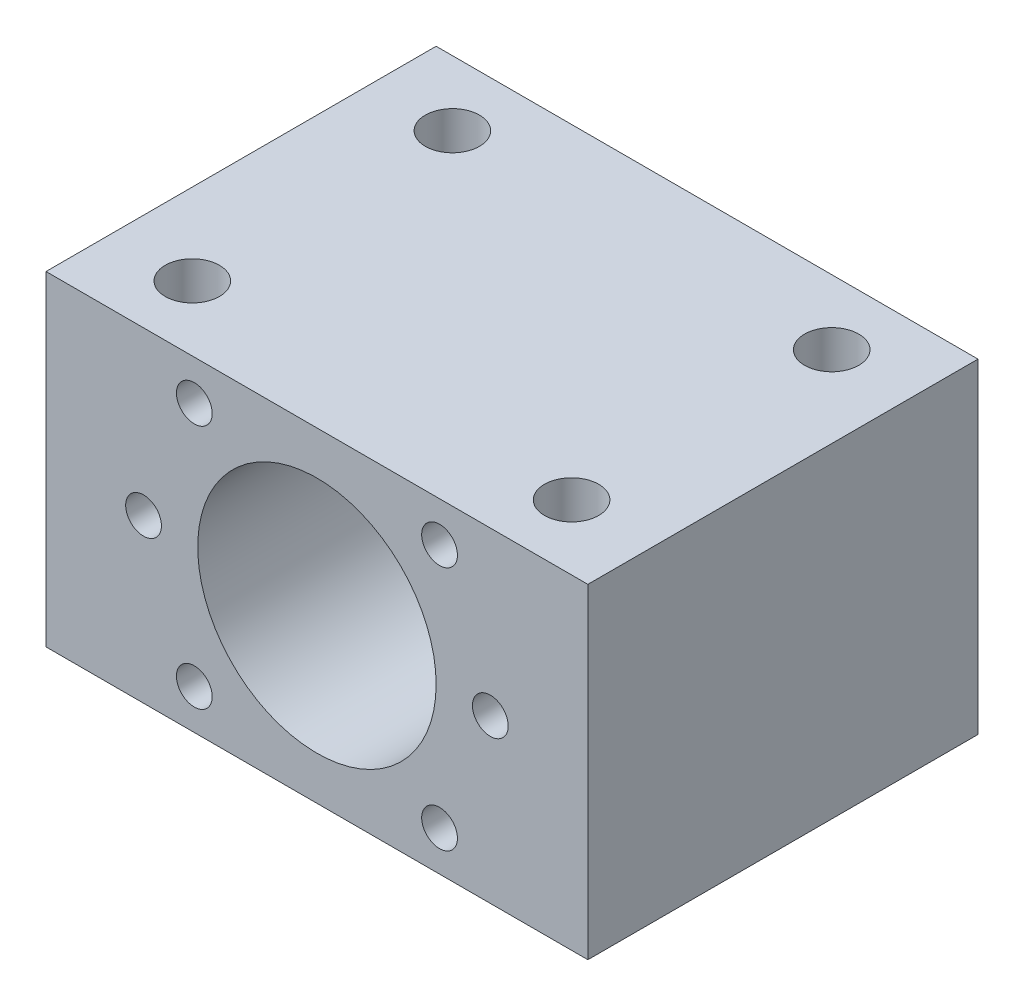
ISO-10303-21;
HEADER;
FILE_DESCRIPTION(('STEP AP214'),'2;1');
FILE_NAME('part.step','',(''),(''),'','','');
FILE_SCHEMA(('AUTOMOTIVE_DESIGN { 1 0 10303 214 1 1 1 1 }'));
ENDSEC;
DATA;
#1=APPLICATION_CONTEXT('core data for automotive mechanical design processes');
#2=APPLICATION_PROTOCOL_DEFINITION('international standard','automotive_design',2000,#1);
#3=PRODUCT_CONTEXT('',#1,'mechanical');
#4=PRODUCT('Part','Part','',(#3));
#5=PRODUCT_RELATED_PRODUCT_CATEGORY('part','',(#4));
#6=PRODUCT_DEFINITION_FORMATION('','',#4);
#7=PRODUCT_DEFINITION_CONTEXT('part definition',#1,'design');
#8=PRODUCT_DEFINITION('design','',#6,#7);
#9=PRODUCT_DEFINITION_SHAPE('','',#8);
#10=(LENGTH_UNIT() NAMED_UNIT(*) SI_UNIT(.MILLI.,.METRE.));
#11=(NAMED_UNIT(*) PLANE_ANGLE_UNIT() SI_UNIT($,.RADIAN.));
#12=(NAMED_UNIT(*) SI_UNIT($,.STERADIAN.) SOLID_ANGLE_UNIT());
#13=UNCERTAINTY_MEASURE_WITH_UNIT(LENGTH_MEASURE(1.E-05),#10,'distance_accuracy_value','');
#14=(GEOMETRIC_REPRESENTATION_CONTEXT(3) GLOBAL_UNCERTAINTY_ASSIGNED_CONTEXT((#13)) GLOBAL_UNIT_ASSIGNED_CONTEXT((#10,
#11,#12)) REPRESENTATION_CONTEXT('',''));
#15=CARTESIAN_POINT('',(0.,0.,0.));
#16=DIRECTION('',(0.,0.,1.));
#17=DIRECTION('',(1.,0.,0.));
#18=AXIS2_PLACEMENT_3D('',#15,#16,#17);
#19=CARTESIAN_POINT('',(0.,0.,36.));
#20=DIRECTION('',(0.,0.,-1.));
#21=DIRECTION('',(-1.,0.,0.));
#22=AXIS2_PLACEMENT_3D('',#19,#20,#21);
#23=PLANE('',#22);
#24=CARTESIAN_POINT('',(-16.,0.,36.));
#25=DIRECTION('',(0.,0.,1.));
#26=DIRECTION('',(1.,0.,0.));
#27=AXIS2_PLACEMENT_3D('',#24,#25,#26);
#28=CIRCLE('',#27,1.65);
#29=CARTESIAN_POINT('',(-14.35,0.,36.));
#30=VERTEX_POINT('',#29);
#31=EDGE_CURVE('E115',#30,#30,#28,.T.);
#32=ORIENTED_EDGE('',*,*,#31,.F.);
#33=EDGE_LOOP('',(#32));
#34=FACE_BOUND('',#33,.T.);
#35=CARTESIAN_POINT('',(-11.3137084989847,11.3137084989848,36.));
#36=DIRECTION('',(0.,0.,1.));
#37=DIRECTION('',(1.,0.,0.));
#38=AXIS2_PLACEMENT_3D('',#35,#36,#37);
#39=CIRCLE('',#38,1.65);
#40=CARTESIAN_POINT('',(-9.66370849898474,11.3137084989848,36.));
#41=VERTEX_POINT('',#40);
#42=EDGE_CURVE('E114',#41,#41,#39,.T.);
#43=ORIENTED_EDGE('',*,*,#42,.F.);
#44=EDGE_LOOP('',(#43));
#45=FACE_BOUND('',#44,.T.);
#46=CARTESIAN_POINT('',(-11.3137084989847,-11.3137084989848,36.));
#47=DIRECTION('',(0.,0.,1.));
#48=DIRECTION('',(1.,0.,0.));
#49=AXIS2_PLACEMENT_3D('',#46,#47,#48);
#50=CIRCLE('',#49,1.65);
#51=CARTESIAN_POINT('',(-9.66370849898474,-11.3137084989848,36.));
#52=VERTEX_POINT('',#51);
#53=EDGE_CURVE('E127',#52,#52,#50,.T.);
#54=ORIENTED_EDGE('',*,*,#53,.F.);
#55=EDGE_LOOP('',(#54));
#56=FACE_BOUND('',#55,.T.);
#57=CARTESIAN_POINT('',(11.3137084989847,-11.3137084989848,36.));
#58=DIRECTION('',(0.,0.,1.));
#59=DIRECTION('',(1.,0.,0.));
#60=AXIS2_PLACEMENT_3D('',#57,#58,#59);
#61=CIRCLE('',#60,1.65);
#62=CARTESIAN_POINT('',(12.9637084989847,-11.3137084989848,36.));
#63=VERTEX_POINT('',#62);
#64=EDGE_CURVE('E133',#63,#63,#61,.T.);
#65=ORIENTED_EDGE('',*,*,#64,.F.);
#66=EDGE_LOOP('',(#65));
#67=FACE_BOUND('',#66,.T.);
#68=CARTESIAN_POINT('',(16.,0.,36.));
#69=DIRECTION('',(0.,0.,1.));
#70=DIRECTION('',(1.,0.,0.));
#71=AXIS2_PLACEMENT_3D('',#68,#69,#70);
#72=CIRCLE('',#71,1.65);
#73=CARTESIAN_POINT('',(17.65,0.,36.));
#74=VERTEX_POINT('',#73);
#75=EDGE_CURVE('E139',#74,#74,#72,.T.);
#76=ORIENTED_EDGE('',*,*,#75,.F.);
#77=EDGE_LOOP('',(#76));
#78=FACE_BOUND('',#77,.T.);
#79=CARTESIAN_POINT('',(11.3137084989847,11.3137084989848,36.));
#80=DIRECTION('',(0.,0.,1.));
#81=DIRECTION('',(1.,0.,0.));
#82=AXIS2_PLACEMENT_3D('',#79,#80,#81);
#83=CIRCLE('',#82,1.65);
#84=CARTESIAN_POINT('',(12.9637084989847,11.3137084989848,36.));
#85=VERTEX_POINT('',#84);
#86=EDGE_CURVE('E145',#85,#85,#83,.T.);
#87=ORIENTED_EDGE('',*,*,#86,.F.);
#88=EDGE_LOOP('',(#87));
#89=FACE_BOUND('',#88,.T.);
#90=DIRECTION('',(0.,1.,0.));
#91=VECTOR('',#90,1.);
#92=CARTESIAN_POINT('',(25.,-15.,36.));
#93=LINE('',#92,#91);
#94=CARTESIAN_POINT('',(25.,-15.,36.));
#95=VERTEX_POINT('',#94);
#96=CARTESIAN_POINT('',(25.,15.,36.));
#97=VERTEX_POINT('',#96);
#98=EDGE_CURVE('E158',#95,#97,#93,.T.);
#99=ORIENTED_EDGE('',*,*,#98,.T.);
#100=DIRECTION('',(-1.,0.,0.));
#101=VECTOR('',#100,1.);
#102=CARTESIAN_POINT('',(-25.,15.,36.));
#103=LINE('',#102,#101);
#104=CARTESIAN_POINT('',(-25.,15.,36.));
#105=VERTEX_POINT('',#104);
#106=EDGE_CURVE('E85',#97,#105,#103,.T.);
#107=ORIENTED_EDGE('',*,*,#106,.T.);
#108=DIRECTION('',(0.,-1.,0.));
#109=VECTOR('',#108,1.);
#110=CARTESIAN_POINT('',(-25.,-15.,36.));
#111=LINE('',#110,#109);
#112=CARTESIAN_POINT('',(-25.,-15.,36.));
#113=VERTEX_POINT('',#112);
#114=EDGE_CURVE('E161',#105,#113,#111,.T.);
#115=ORIENTED_EDGE('',*,*,#114,.T.);
#116=DIRECTION('',(1.,0.,0.));
#117=VECTOR('',#116,1.);
#118=CARTESIAN_POINT('',(-25.,-15.,36.));
#119=LINE('',#118,#117);
#120=EDGE_CURVE('E54',#113,#95,#119,.T.);
#121=ORIENTED_EDGE('',*,*,#120,.T.);
#122=EDGE_LOOP('',(#99,#107,#115,#121));
#123=FACE_BOUND('',#122,.T.);
#124=CARTESIAN_POINT('',(0.,0.,36.));
#125=DIRECTION('',(0.,0.,1.));
#126=DIRECTION('',(1.,0.,0.));
#127=AXIS2_PLACEMENT_3D('',#124,#125,#126);
#128=CIRCLE('',#127,11.);
#129=CARTESIAN_POINT('',(11.,0.,36.));
#130=VERTEX_POINT('',#129);
#131=EDGE_CURVE('E152',#130,#130,#128,.T.);
#132=ORIENTED_EDGE('',*,*,#131,.F.);
#133=EDGE_LOOP('',(#132));
#134=FACE_BOUND('',#133,.T.);
#135=ADVANCED_FACE('F37',(#34,#45,#56,#67,#78,#89,#123,#134),#23,.F.);
#136=CARTESIAN_POINT('',(0.,0.,0.));
#137=DIRECTION('',(0.,0.,-1.));
#138=DIRECTION('',(-1.,0.,0.));
#139=AXIS2_PLACEMENT_3D('',#136,#137,#138);
#140=PLANE('',#139);
#141=DIRECTION('',(0.,1.,0.));
#142=VECTOR('',#141,1.);
#143=CARTESIAN_POINT('',(25.,-15.,0.));
#144=LINE('',#143,#142);
#145=CARTESIAN_POINT('',(25.,-15.,0.));
#146=VERTEX_POINT('',#145);
#147=CARTESIAN_POINT('',(25.,15.,0.));
#148=VERTEX_POINT('',#147);
#149=EDGE_CURVE('E155',#146,#148,#144,.T.);
#150=ORIENTED_EDGE('',*,*,#149,.F.);
#151=DIRECTION('',(1.,0.,0.));
#152=VECTOR('',#151,1.);
#153=CARTESIAN_POINT('',(-25.,-15.,0.));
#154=LINE('',#153,#152);
#155=CARTESIAN_POINT('',(-25.,-15.,0.));
#156=VERTEX_POINT('',#155);
#157=EDGE_CURVE('E78',#156,#146,#154,.T.);
#158=ORIENTED_EDGE('',*,*,#157,.F.);
#159=DIRECTION('',(0.,-1.,0.));
#160=VECTOR('',#159,1.);
#161=CARTESIAN_POINT('',(-25.,-15.,0.));
#162=LINE('',#161,#160);
#163=CARTESIAN_POINT('',(-25.,15.,0.));
#164=VERTEX_POINT('',#163);
#165=EDGE_CURVE('E72',#164,#156,#162,.T.);
#166=ORIENTED_EDGE('',*,*,#165,.F.);
#167=DIRECTION('',(-1.,0.,0.));
#168=VECTOR('',#167,1.);
#169=CARTESIAN_POINT('',(-25.,15.,0.));
#170=LINE('',#169,#168);
#171=EDGE_CURVE('E167',#148,#164,#170,.T.);
#172=ORIENTED_EDGE('',*,*,#171,.F.);
#173=EDGE_LOOP('',(#150,#158,#166,#172));
#174=FACE_BOUND('',#173,.T.);
#175=CARTESIAN_POINT('',(0.,0.,0.));
#176=DIRECTION('',(0.,0.,1.));
#177=DIRECTION('',(1.,0.,0.));
#178=AXIS2_PLACEMENT_3D('',#175,#176,#177);
#179=CIRCLE('',#178,11.);
#180=CARTESIAN_POINT('',(11.,0.,0.));
#181=VERTEX_POINT('',#180);
#182=EDGE_CURVE('E151',#181,#181,#179,.T.);
#183=ORIENTED_EDGE('',*,*,#182,.T.);
#184=EDGE_LOOP('',(#183));
#185=FACE_BOUND('',#184,.T.);
#186=ADVANCED_FACE('F177',(#174,#185),#140,.T.);
#187=CARTESIAN_POINT('',(25.,-15.,36.));
#188=DIRECTION('',(-1.,0.,0.));
#189=DIRECTION('',(0.,0.,1.));
#190=AXIS2_PLACEMENT_3D('',#187,#188,#189);
#191=PLANE('',#190);
#192=ORIENTED_EDGE('',*,*,#149,.T.);
#193=DIRECTION('',(0.,0.,-1.));
#194=VECTOR('',#193,1.);
#195=CARTESIAN_POINT('',(25.,15.,36.));
#196=LINE('',#195,#194);
#197=EDGE_CURVE('E11',#97,#148,#196,.T.);
#198=ORIENTED_EDGE('',*,*,#197,.F.);
#199=ORIENTED_EDGE('',*,*,#98,.F.);
#200=DIRECTION('',(0.,0.,-1.));
#201=VECTOR('',#200,1.);
#202=CARTESIAN_POINT('',(25.,-15.,36.));
#203=LINE('',#202,#201);
#204=EDGE_CURVE('E164',#95,#146,#203,.T.);
#205=ORIENTED_EDGE('',*,*,#204,.T.);
#206=EDGE_LOOP('',(#192,#198,#199,#205));
#207=FACE_BOUND('',#206,.T.);
#208=ADVANCED_FACE('F39',(#207),#191,.F.);
#209=CARTESIAN_POINT('',(-25.,15.,36.));
#210=DIRECTION('',(0.,-1.,0.));
#211=DIRECTION('',(0.,0.,-1.));
#212=AXIS2_PLACEMENT_3D('',#209,#210,#211);
#213=PLANE('',#212);
#214=CARTESIAN_POINT('',(-17.5,15.,30.));
#215=DIRECTION('',(0.,1.,0.));
#216=DIRECTION('',(0.,0.,1.));
#217=AXIS2_PLACEMENT_3D('',#214,#215,#216);
#218=CIRCLE('',#217,2.5);
#219=CARTESIAN_POINT('',(-17.5,15.,32.5));
#220=VERTEX_POINT('',#219);
#221=EDGE_CURVE('E297',#220,#220,#218,.T.);
#222=ORIENTED_EDGE('',*,*,#221,.F.);
#223=EDGE_LOOP('',(#222));
#224=FACE_BOUND('',#223,.T.);
#225=CARTESIAN_POINT('',(17.5,15.,30.));
#226=DIRECTION('',(0.,1.,0.));
#227=DIRECTION('',(0.,0.,1.));
#228=AXIS2_PLACEMENT_3D('',#225,#226,#227);
#229=CIRCLE('',#228,2.5);
#230=CARTESIAN_POINT('',(17.5,15.,32.5));
#231=VERTEX_POINT('',#230);
#232=EDGE_CURVE('E291',#231,#231,#229,.T.);
#233=ORIENTED_EDGE('',*,*,#232,.F.);
#234=EDGE_LOOP('',(#233));
#235=FACE_BOUND('',#234,.T.);
#236=CARTESIAN_POINT('',(17.5,15.,6.));
#237=DIRECTION('',(0.,1.,0.));
#238=DIRECTION('',(0.,0.,1.));
#239=AXIS2_PLACEMENT_3D('',#236,#237,#238);
#240=CIRCLE('',#239,2.5);
#241=CARTESIAN_POINT('',(17.5,15.,8.5));
#242=VERTEX_POINT('',#241);
#243=EDGE_CURVE('E282',#242,#242,#240,.T.);
#244=ORIENTED_EDGE('',*,*,#243,.F.);
#245=EDGE_LOOP('',(#244));
#246=FACE_BOUND('',#245,.T.);
#247=CARTESIAN_POINT('',(-17.5,15.,6.));
#248=DIRECTION('',(0.,1.,0.));
#249=DIRECTION('',(0.,0.,1.));
#250=AXIS2_PLACEMENT_3D('',#247,#248,#249);
#251=CIRCLE('',#250,2.5);
#252=CARTESIAN_POINT('',(-17.5,15.,8.5));
#253=VERTEX_POINT('',#252);
#254=EDGE_CURVE('E281',#253,#253,#251,.T.);
#255=ORIENTED_EDGE('',*,*,#254,.F.);
#256=EDGE_LOOP('',(#255));
#257=FACE_BOUND('',#256,.T.);
#258=ORIENTED_EDGE('',*,*,#171,.T.);
#259=DIRECTION('',(0.,0.,-1.));
#260=VECTOR('',#259,1.);
#261=CARTESIAN_POINT('',(-25.,15.,36.));
#262=LINE('',#261,#260);
#263=EDGE_CURVE('E46',#105,#164,#262,.T.);
#264=ORIENTED_EDGE('',*,*,#263,.F.);
#265=ORIENTED_EDGE('',*,*,#106,.F.);
#266=ORIENTED_EDGE('',*,*,#197,.T.);
#267=EDGE_LOOP('',(#258,#264,#265,#266));
#268=FACE_BOUND('',#267,.T.);
#269=ADVANCED_FACE('F193',(#224,#235,#246,#257,#268),#213,.F.);
#270=CARTESIAN_POINT('',(-25.,-15.,36.));
#271=DIRECTION('',(1.,0.,0.));
#272=DIRECTION('',(0.,0.,-1.));
#273=AXIS2_PLACEMENT_3D('',#270,#271,#272);
#274=PLANE('',#273);
#275=ORIENTED_EDGE('',*,*,#165,.T.);
#276=DIRECTION('',(0.,0.,-1.));
#277=VECTOR('',#276,1.);
#278=CARTESIAN_POINT('',(-25.,-15.,36.));
#279=LINE('',#278,#277);
#280=EDGE_CURVE('E172',#113,#156,#279,.T.);
#281=ORIENTED_EDGE('',*,*,#280,.F.);
#282=ORIENTED_EDGE('',*,*,#114,.F.);
#283=ORIENTED_EDGE('',*,*,#263,.T.);
#284=EDGE_LOOP('',(#275,#281,#282,#283));
#285=FACE_BOUND('',#284,.T.);
#286=ADVANCED_FACE('F174',(#285),#274,.F.);
#287=CARTESIAN_POINT('',(-25.,-15.,36.));
#288=DIRECTION('',(0.,1.,0.));
#289=DIRECTION('',(0.,0.,1.));
#290=AXIS2_PLACEMENT_3D('',#287,#288,#289);
#291=PLANE('',#290);
#292=ORIENTED_EDGE('',*,*,#157,.T.);
#293=ORIENTED_EDGE('',*,*,#204,.F.);
#294=ORIENTED_EDGE('',*,*,#120,.F.);
#295=ORIENTED_EDGE('',*,*,#280,.T.);
#296=EDGE_LOOP('',(#292,#293,#294,#295));
#297=FACE_BOUND('',#296,.T.);
#298=ADVANCED_FACE('F182',(#297),#291,.F.);
#299=CARTESIAN_POINT('',(0.,0.,36.));
#300=DIRECTION('',(0.,0.,-1.));
#301=DIRECTION('',(-1.,0.,0.));
#302=AXIS2_PLACEMENT_3D('',#299,#300,#301);
#303=CYLINDRICAL_SURFACE('',#302,11.);
#304=ORIENTED_EDGE('',*,*,#131,.T.);
#305=EDGE_LOOP('',(#304));
#306=FACE_BOUND('',#305,.T.);
#307=ORIENTED_EDGE('',*,*,#182,.F.);
#308=EDGE_LOOP('',(#307));
#309=FACE_BOUND('',#308,.T.);
#310=ADVANCED_FACE('F184',(#306,#309),#303,.F.);
#311=CARTESIAN_POINT('',(11.3137084989847,11.3137084989848,28.9914200213955));
#312=DIRECTION('',(0.,0.,1.));
#313=DIRECTION('',(1.,0.,0.));
#314=AXIS2_PLACEMENT_3D('',#311,#312,#313);
#315=CONICAL_SURFACE('',#314,1.65,1.02974425867665);
#316=CARTESIAN_POINT('',(11.3137084989847,11.3137084989848,28.));
#317=VERTEX_POINT('',#316);
#318=VERTEX_LOOP('',#317);
#319=FACE_BOUND('',#318,.T.);
#320=CARTESIAN_POINT('',(11.3137084989847,11.3137084989848,28.9914200213955));
#321=DIRECTION('',(0.,0.,1.));
#322=DIRECTION('',(1.,0.,0.));
#323=AXIS2_PLACEMENT_3D('',#320,#321,#322);
#324=CIRCLE('',#323,1.65);
#325=CARTESIAN_POINT('',(12.9637084989847,11.3137084989848,28.9914200213955));
#326=VERTEX_POINT('',#325);
#327=EDGE_CURVE('E148',#326,#326,#324,.T.);
#328=ORIENTED_EDGE('',*,*,#327,.T.);
#329=EDGE_LOOP('',(#328));
#330=FACE_BOUND('',#329,.T.);
#331=ADVANCED_FACE('F190',(#319,#330),#315,.F.);
#332=CARTESIAN_POINT('',(11.3137084989847,11.3137084989848,36.));
#333=DIRECTION('',(0.,0.,1.));
#334=DIRECTION('',(1.,0.,0.));
#335=AXIS2_PLACEMENT_3D('',#332,#333,#334);
#336=CYLINDRICAL_SURFACE('',#335,1.65);
#337=ORIENTED_EDGE('',*,*,#327,.F.);
#338=EDGE_LOOP('',(#337));
#339=FACE_BOUND('',#338,.T.);
#340=ORIENTED_EDGE('',*,*,#86,.T.);
#341=EDGE_LOOP('',(#340));
#342=FACE_BOUND('',#341,.T.);
#343=ADVANCED_FACE('F207',(#339,#342),#336,.F.);
#344=CARTESIAN_POINT('',(16.,0.,28.9914200213955));
#345=DIRECTION('',(0.,0.,1.));
#346=DIRECTION('',(1.,0.,0.));
#347=AXIS2_PLACEMENT_3D('',#344,#345,#346);
#348=CONICAL_SURFACE('',#347,1.65,1.02974425867665);
#349=CARTESIAN_POINT('',(16.,0.,28.));
#350=VERTEX_POINT('',#349);
#351=VERTEX_LOOP('',#350);
#352=FACE_BOUND('',#351,.T.);
#353=CARTESIAN_POINT('',(16.,0.,28.9914200213955));
#354=DIRECTION('',(0.,0.,1.));
#355=DIRECTION('',(1.,0.,0.));
#356=AXIS2_PLACEMENT_3D('',#353,#354,#355);
#357=CIRCLE('',#356,1.65);
#358=CARTESIAN_POINT('',(17.65,0.,28.9914200213955));
#359=VERTEX_POINT('',#358);
#360=EDGE_CURVE('E142',#359,#359,#357,.T.);
#361=ORIENTED_EDGE('',*,*,#360,.T.);
#362=EDGE_LOOP('',(#361));
#363=FACE_BOUND('',#362,.T.);
#364=ADVANCED_FACE('F211',(#352,#363),#348,.F.);
#365=CARTESIAN_POINT('',(16.,0.,36.));
#366=DIRECTION('',(0.,0.,1.));
#367=DIRECTION('',(1.,0.,0.));
#368=AXIS2_PLACEMENT_3D('',#365,#366,#367);
#369=CYLINDRICAL_SURFACE('',#368,1.65);
#370=ORIENTED_EDGE('',*,*,#360,.F.);
#371=EDGE_LOOP('',(#370));
#372=FACE_BOUND('',#371,.T.);
#373=ORIENTED_EDGE('',*,*,#75,.T.);
#374=EDGE_LOOP('',(#373));
#375=FACE_BOUND('',#374,.T.);
#376=ADVANCED_FACE('F215',(#372,#375),#369,.F.);
#377=CARTESIAN_POINT('',(11.3137084989847,-11.3137084989848,28.9914200213955));
#378=DIRECTION('',(0.,0.,1.));
#379=DIRECTION('',(1.,0.,0.));
#380=AXIS2_PLACEMENT_3D('',#377,#378,#379);
#381=CONICAL_SURFACE('',#380,1.65,1.02974425867665);
#382=CARTESIAN_POINT('',(11.3137084989847,-11.3137084989848,28.));
#383=VERTEX_POINT('',#382);
#384=VERTEX_LOOP('',#383);
#385=FACE_BOUND('',#384,.T.);
#386=CARTESIAN_POINT('',(11.3137084989847,-11.3137084989848,28.9914200213955));
#387=DIRECTION('',(0.,0.,1.));
#388=DIRECTION('',(1.,0.,0.));
#389=AXIS2_PLACEMENT_3D('',#386,#387,#388);
#390=CIRCLE('',#389,1.65);
#391=CARTESIAN_POINT('',(12.9637084989847,-11.3137084989848,28.9914200213955));
#392=VERTEX_POINT('',#391);
#393=EDGE_CURVE('E136',#392,#392,#390,.T.);
#394=ORIENTED_EDGE('',*,*,#393,.T.);
#395=EDGE_LOOP('',(#394));
#396=FACE_BOUND('',#395,.T.);
#397=ADVANCED_FACE('F219',(#385,#396),#381,.F.);
#398=CARTESIAN_POINT('',(11.3137084989847,-11.3137084989848,36.));
#399=DIRECTION('',(0.,0.,1.));
#400=DIRECTION('',(1.,0.,0.));
#401=AXIS2_PLACEMENT_3D('',#398,#399,#400);
#402=CYLINDRICAL_SURFACE('',#401,1.65);
#403=ORIENTED_EDGE('',*,*,#393,.F.);
#404=EDGE_LOOP('',(#403));
#405=FACE_BOUND('',#404,.T.);
#406=ORIENTED_EDGE('',*,*,#64,.T.);
#407=EDGE_LOOP('',(#406));
#408=FACE_BOUND('',#407,.T.);
#409=ADVANCED_FACE('F223',(#405,#408),#402,.F.);
#410=CARTESIAN_POINT('',(-11.3137084989847,-11.3137084989848,28.9914200213955));
#411=DIRECTION('',(0.,0.,1.));
#412=DIRECTION('',(1.,0.,0.));
#413=AXIS2_PLACEMENT_3D('',#410,#411,#412);
#414=CONICAL_SURFACE('',#413,1.65,1.02974425867665);
#415=CARTESIAN_POINT('',(-11.3137084989847,-11.3137084989848,28.));
#416=VERTEX_POINT('',#415);
#417=VERTEX_LOOP('',#416);
#418=FACE_BOUND('',#417,.T.);
#419=CARTESIAN_POINT('',(-11.3137084989847,-11.3137084989848,28.9914200213955));
#420=DIRECTION('',(0.,0.,1.));
#421=DIRECTION('',(1.,0.,0.));
#422=AXIS2_PLACEMENT_3D('',#419,#420,#421);
#423=CIRCLE('',#422,1.65);
#424=CARTESIAN_POINT('',(-9.66370849898474,-11.3137084989848,28.9914200213955));
#425=VERTEX_POINT('',#424);
#426=EDGE_CURVE('E130',#425,#425,#423,.T.);
#427=ORIENTED_EDGE('',*,*,#426,.T.);
#428=EDGE_LOOP('',(#427));
#429=FACE_BOUND('',#428,.T.);
#430=ADVANCED_FACE('F227',(#418,#429),#414,.F.);
#431=CARTESIAN_POINT('',(-11.3137084989847,-11.3137084989848,36.));
#432=DIRECTION('',(0.,0.,1.));
#433=DIRECTION('',(1.,0.,0.));
#434=AXIS2_PLACEMENT_3D('',#431,#432,#433);
#435=CYLINDRICAL_SURFACE('',#434,1.65);
#436=ORIENTED_EDGE('',*,*,#426,.F.);
#437=EDGE_LOOP('',(#436));
#438=FACE_BOUND('',#437,.T.);
#439=ORIENTED_EDGE('',*,*,#53,.T.);
#440=EDGE_LOOP('',(#439));
#441=FACE_BOUND('',#440,.T.);
#442=ADVANCED_FACE('F231',(#438,#441),#435,.F.);
#443=CARTESIAN_POINT('',(-11.3137084989847,11.3137084989848,28.9914200213955));
#444=DIRECTION('',(0.,0.,1.));
#445=DIRECTION('',(1.,0.,0.));
#446=AXIS2_PLACEMENT_3D('',#443,#444,#445);
#447=CONICAL_SURFACE('',#446,1.65,1.02974425867665);
#448=CARTESIAN_POINT('',(-11.3137084989847,11.3137084989848,28.));
#449=VERTEX_POINT('',#448);
#450=VERTEX_LOOP('',#449);
#451=FACE_BOUND('',#450,.T.);
#452=CARTESIAN_POINT('',(-11.3137084989847,11.3137084989848,28.9914200213955));
#453=DIRECTION('',(0.,0.,1.));
#454=DIRECTION('',(1.,0.,0.));
#455=AXIS2_PLACEMENT_3D('',#452,#453,#454);
#456=CIRCLE('',#455,1.65);
#457=CARTESIAN_POINT('',(-9.66370849898474,11.3137084989848,28.9914200213955));
#458=VERTEX_POINT('',#457);
#459=EDGE_CURVE('E118',#458,#458,#456,.T.);
#460=ORIENTED_EDGE('',*,*,#459,.T.);
#461=EDGE_LOOP('',(#460));
#462=FACE_BOUND('',#461,.T.);
#463=ADVANCED_FACE('F235',(#451,#462),#447,.F.);
#464=CARTESIAN_POINT('',(-11.3137084989847,11.3137084989848,36.));
#465=DIRECTION('',(0.,0.,1.));
#466=DIRECTION('',(1.,0.,0.));
#467=AXIS2_PLACEMENT_3D('',#464,#465,#466);
#468=CYLINDRICAL_SURFACE('',#467,1.65);
#469=ORIENTED_EDGE('',*,*,#459,.F.);
#470=EDGE_LOOP('',(#469));
#471=FACE_BOUND('',#470,.T.);
#472=ORIENTED_EDGE('',*,*,#42,.T.);
#473=EDGE_LOOP('',(#472));
#474=FACE_BOUND('',#473,.T.);
#475=ADVANCED_FACE('F108',(#471,#474),#468,.F.);
#476=CARTESIAN_POINT('',(-16.,0.,28.9914200213955));
#477=DIRECTION('',(0.,0.,1.));
#478=DIRECTION('',(1.,0.,0.));
#479=AXIS2_PLACEMENT_3D('',#476,#477,#478);
#480=CONICAL_SURFACE('',#479,1.65,1.02974425867665);
#481=CARTESIAN_POINT('',(-16.,0.,28.));
#482=VERTEX_POINT('',#481);
#483=VERTEX_LOOP('',#482);
#484=FACE_BOUND('',#483,.T.);
#485=CARTESIAN_POINT('',(-16.,0.,28.9914200213955));
#486=DIRECTION('',(0.,0.,1.));
#487=DIRECTION('',(1.,0.,0.));
#488=AXIS2_PLACEMENT_3D('',#485,#486,#487);
#489=CIRCLE('',#488,1.65);
#490=CARTESIAN_POINT('',(-14.35,0.,28.9914200213955));
#491=VERTEX_POINT('',#490);
#492=EDGE_CURVE('E112',#491,#491,#489,.T.);
#493=ORIENTED_EDGE('',*,*,#492,.T.);
#494=EDGE_LOOP('',(#493));
#495=FACE_BOUND('',#494,.T.);
#496=ADVANCED_FACE('F104',(#484,#495),#480,.F.);
#497=CARTESIAN_POINT('',(-16.,0.,36.));
#498=DIRECTION('',(0.,0.,1.));
#499=DIRECTION('',(1.,0.,0.));
#500=AXIS2_PLACEMENT_3D('',#497,#498,#499);
#501=CYLINDRICAL_SURFACE('',#500,1.65);
#502=ORIENTED_EDGE('',*,*,#492,.F.);
#503=EDGE_LOOP('',(#502));
#504=FACE_BOUND('',#503,.T.);
#505=ORIENTED_EDGE('',*,*,#31,.T.);
#506=EDGE_LOOP('',(#505));
#507=FACE_BOUND('',#506,.T.);
#508=ADVANCED_FACE('F107',(#504,#507),#501,.F.);
#509=CARTESIAN_POINT('',(-17.5,3.,6.));
#510=DIRECTION('',(0.,1.,0.));
#511=DIRECTION('',(0.,0.,1.));
#512=AXIS2_PLACEMENT_3D('',#509,#510,#511);
#513=CYLINDRICAL_SURFACE('',#512,2.5);
#514=CARTESIAN_POINT('',(-17.5,3.,6.));
#515=DIRECTION('',(0.,1.,0.));
#516=DIRECTION('',(0.,0.,1.));
#517=AXIS2_PLACEMENT_3D('',#514,#515,#516);
#518=CIRCLE('',#517,2.5);
#519=CARTESIAN_POINT('',(-17.5,3.,8.5));
#520=VERTEX_POINT('',#519);
#521=EDGE_CURVE('E121',#520,#520,#518,.T.);
#522=ORIENTED_EDGE('',*,*,#521,.F.);
#523=EDGE_LOOP('',(#522));
#524=FACE_BOUND('',#523,.T.);
#525=ORIENTED_EDGE('',*,*,#254,.T.);
#526=EDGE_LOOP('',(#525));
#527=FACE_BOUND('',#526,.T.);
#528=ADVANCED_FACE('F245',(#524,#527),#513,.F.);
#529=CARTESIAN_POINT('',(-17.5,3.,6.));
#530=DIRECTION('',(0.,1.,0.));
#531=DIRECTION('',(0.,0.,1.));
#532=AXIS2_PLACEMENT_3D('',#529,#530,#531);
#533=PLANE('',#532);
#534=ORIENTED_EDGE('',*,*,#521,.T.);
#535=EDGE_LOOP('',(#534));
#536=FACE_BOUND('',#535,.T.);
#537=ADVANCED_FACE('F248',(#536),#533,.T.);
#538=CARTESIAN_POINT('',(17.5,3.,6.));
#539=DIRECTION('',(0.,1.,0.));
#540=DIRECTION('',(0.,0.,1.));
#541=AXIS2_PLACEMENT_3D('',#538,#539,#540);
#542=CYLINDRICAL_SURFACE('',#541,2.5);
#543=CARTESIAN_POINT('',(17.5,3.,6.));
#544=DIRECTION('',(0.,1.,0.));
#545=DIRECTION('',(0.,0.,1.));
#546=AXIS2_PLACEMENT_3D('',#543,#544,#545);
#547=CIRCLE('',#546,2.5);
#548=CARTESIAN_POINT('',(17.5,3.,8.5));
#549=VERTEX_POINT('',#548);
#550=EDGE_CURVE('E280',#549,#549,#547,.T.);
#551=ORIENTED_EDGE('',*,*,#550,.F.);
#552=EDGE_LOOP('',(#551));
#553=FACE_BOUND('',#552,.T.);
#554=ORIENTED_EDGE('',*,*,#243,.T.);
#555=EDGE_LOOP('',(#554));
#556=FACE_BOUND('',#555,.T.);
#557=ADVANCED_FACE('F252',(#553,#556),#542,.F.);
#558=CARTESIAN_POINT('',(17.5,3.,6.));
#559=DIRECTION('',(0.,1.,0.));
#560=DIRECTION('',(0.,0.,1.));
#561=AXIS2_PLACEMENT_3D('',#558,#559,#560);
#562=PLANE('',#561);
#563=ORIENTED_EDGE('',*,*,#550,.T.);
#564=EDGE_LOOP('',(#563));
#565=FACE_BOUND('',#564,.T.);
#566=ADVANCED_FACE('F266',(#565),#562,.T.);
#567=CARTESIAN_POINT('',(17.5,3.,30.));
#568=DIRECTION('',(0.,1.,0.));
#569=DIRECTION('',(0.,0.,1.));
#570=AXIS2_PLACEMENT_3D('',#567,#568,#569);
#571=CYLINDRICAL_SURFACE('',#570,2.5);
#572=CARTESIAN_POINT('',(17.5,3.,30.));
#573=DIRECTION('',(0.,1.,0.));
#574=DIRECTION('',(0.,0.,1.));
#575=AXIS2_PLACEMENT_3D('',#572,#573,#574);
#576=CIRCLE('',#575,2.5);
#577=CARTESIAN_POINT('',(17.5,3.,32.5));
#578=VERTEX_POINT('',#577);
#579=EDGE_CURVE('E286',#578,#578,#576,.T.);
#580=ORIENTED_EDGE('',*,*,#579,.F.);
#581=EDGE_LOOP('',(#580));
#582=FACE_BOUND('',#581,.T.);
#583=ORIENTED_EDGE('',*,*,#232,.T.);
#584=EDGE_LOOP('',(#583));
#585=FACE_BOUND('',#584,.T.);
#586=ADVANCED_FACE('F263',(#582,#585),#571,.F.);
#587=CARTESIAN_POINT('',(17.5,3.,30.));
#588=DIRECTION('',(0.,1.,0.));
#589=DIRECTION('',(0.,0.,1.));
#590=AXIS2_PLACEMENT_3D('',#587,#588,#589);
#591=PLANE('',#590);
#592=ORIENTED_EDGE('',*,*,#579,.T.);
#593=EDGE_LOOP('',(#592));
#594=FACE_BOUND('',#593,.T.);
#595=ADVANCED_FACE('F258',(#594),#591,.T.);
#596=CARTESIAN_POINT('',(-17.5,3.,30.));
#597=DIRECTION('',(0.,1.,0.));
#598=DIRECTION('',(0.,0.,1.));
#599=AXIS2_PLACEMENT_3D('',#596,#597,#598);
#600=CYLINDRICAL_SURFACE('',#599,2.5);
#601=CARTESIAN_POINT('',(-17.5,3.,30.));
#602=DIRECTION('',(0.,1.,0.));
#603=DIRECTION('',(0.,0.,1.));
#604=AXIS2_PLACEMENT_3D('',#601,#602,#603);
#605=CIRCLE('',#604,2.5);
#606=CARTESIAN_POINT('',(-17.5,3.,32.5));
#607=VERTEX_POINT('',#606);
#608=EDGE_CURVE('E294',#607,#607,#605,.T.);
#609=ORIENTED_EDGE('',*,*,#608,.F.);
#610=EDGE_LOOP('',(#609));
#611=FACE_BOUND('',#610,.T.);
#612=ORIENTED_EDGE('',*,*,#221,.T.);
#613=EDGE_LOOP('',(#612));
#614=FACE_BOUND('',#613,.T.);
#615=ADVANCED_FACE('F254',(#611,#614),#600,.F.);
#616=CARTESIAN_POINT('',(-17.5,3.,30.));
#617=DIRECTION('',(0.,1.,0.));
#618=DIRECTION('',(0.,0.,1.));
#619=AXIS2_PLACEMENT_3D('',#616,#617,#618);
#620=PLANE('',#619);
#621=ORIENTED_EDGE('',*,*,#608,.T.);
#622=EDGE_LOOP('',(#621));
#623=FACE_BOUND('',#622,.T.);
#624=ADVANCED_FACE('F257',(#623),#620,.T.);
#625=CLOSED_SHELL('',(#135,#186,#208,#269,#286,#298,#310,#331,#343,#364,#376,#397,#409,#430,
#442,#463,#475,#496,#508,#528,#537,#557,#566,#586,#595,#615,#624));
#626=MANIFOLD_SOLID_BREP('B2',#625);
#627=ADVANCED_BREP_SHAPE_REPRESENTATION('',(#18,#626),#14);
#628=SHAPE_DEFINITION_REPRESENTATION(#9,#627);
ENDSEC;
END-ISO-10303-21;
